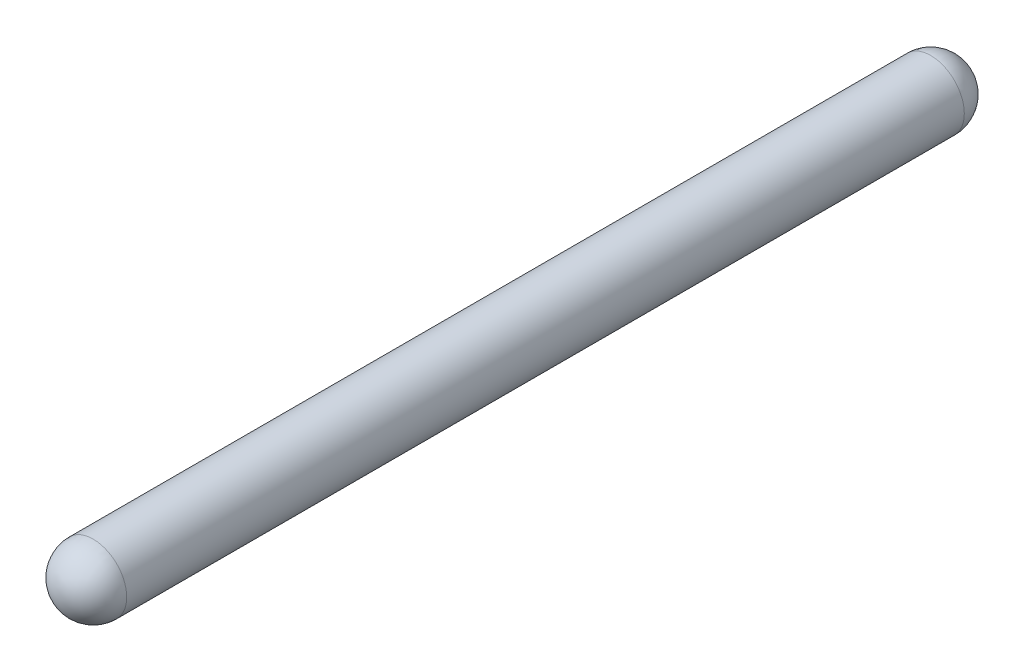
ISO-10303-21;
HEADER;
FILE_DESCRIPTION(('STEP AP214'),'2;1');
FILE_NAME('part.step','',(''),(''),'','','');
FILE_SCHEMA(('AUTOMOTIVE_DESIGN { 1 0 10303 214 1 1 1 1 }'));
ENDSEC;
DATA;
#1=APPLICATION_CONTEXT('core data for automotive mechanical design processes');
#2=APPLICATION_PROTOCOL_DEFINITION('international standard','automotive_design',2000,#1);
#3=PRODUCT_CONTEXT('',#1,'mechanical');
#4=PRODUCT('Part','Part','',(#3));
#5=PRODUCT_RELATED_PRODUCT_CATEGORY('part','',(#4));
#6=PRODUCT_DEFINITION_FORMATION('','',#4);
#7=PRODUCT_DEFINITION_CONTEXT('part definition',#1,'design');
#8=PRODUCT_DEFINITION('design','',#6,#7);
#9=PRODUCT_DEFINITION_SHAPE('','',#8);
#10=(LENGTH_UNIT() NAMED_UNIT(*) SI_UNIT(.MILLI.,.METRE.));
#11=(NAMED_UNIT(*) PLANE_ANGLE_UNIT() SI_UNIT($,.RADIAN.));
#12=(NAMED_UNIT(*) SI_UNIT($,.STERADIAN.) SOLID_ANGLE_UNIT());
#13=UNCERTAINTY_MEASURE_WITH_UNIT(LENGTH_MEASURE(1.E-05),#10,'distance_accuracy_value','');
#14=(GEOMETRIC_REPRESENTATION_CONTEXT(3) GLOBAL_UNCERTAINTY_ASSIGNED_CONTEXT((#13)) GLOBAL_UNIT_ASSIGNED_CONTEXT((#10,
#11,#12)) REPRESENTATION_CONTEXT('',''));
#15=CARTESIAN_POINT('',(0.,0.,0.));
#16=DIRECTION('',(0.,0.,1.));
#17=DIRECTION('',(1.,0.,0.));
#18=AXIS2_PLACEMENT_3D('',#15,#16,#17);
#19=CARTESIAN_POINT('',(0.,0.,-3.));
#20=DIRECTION('',(1.,0.,0.));
#21=DIRECTION('',(0.,-1.,0.));
#22=AXIS2_PLACEMENT_3D('',#19,#20,#21);
#23=SPHERICAL_SURFACE('',#22,0.2);
#24=CARTESIAN_POINT('',(0.,0.,-3.));
#25=DIRECTION('',(0.,0.,1.));
#26=DIRECTION('',(1.,0.,0.));
#27=AXIS2_PLACEMENT_3D('',#24,#25,#26);
#28=CIRCLE('',#27,0.2);
#29=CARTESIAN_POINT('',(0.2,0.,-3.));
#30=VERTEX_POINT('',#29);
#31=CARTESIAN_POINT('',(-0.2,0.,-3.));
#32=VERTEX_POINT('',#31);
#33=EDGE_CURVE('E42',#30,#32,#28,.T.);
#34=ORIENTED_EDGE('',*,*,#33,.F.);
#35=CARTESIAN_POINT('',(0.,0.,-3.));
#36=DIRECTION('',(0.,0.,1.));
#37=DIRECTION('',(1.,0.,0.));
#38=AXIS2_PLACEMENT_3D('',#35,#36,#37);
#39=CIRCLE('',#38,0.2);
#40=EDGE_CURVE('E26',#32,#30,#39,.T.);
#41=ORIENTED_EDGE('',*,*,#40,.F.);
#42=EDGE_LOOP('',(#34,#41));
#43=FACE_BOUND('',#42,.T.);
#44=ADVANCED_FACE('F17',(#43),#23,.T.);
#45=CARTESIAN_POINT('',(0.,0.,2.));
#46=DIRECTION('',(1.,0.,0.));
#47=DIRECTION('',(0.,1.,0.));
#48=AXIS2_PLACEMENT_3D('',#45,#46,#47);
#49=SPHERICAL_SURFACE('',#48,0.2);
#50=CARTESIAN_POINT('',(0.,0.,2.));
#51=DIRECTION('',(0.,0.,1.));
#52=DIRECTION('',(1.,0.,0.));
#53=AXIS2_PLACEMENT_3D('',#50,#51,#52);
#54=CIRCLE('',#53,0.2);
#55=CARTESIAN_POINT('',(0.2,0.,2.));
#56=VERTEX_POINT('',#55);
#57=CARTESIAN_POINT('',(-0.2,0.,2.));
#58=VERTEX_POINT('',#57);
#59=EDGE_CURVE('E11',#56,#58,#54,.F.);
#60=ORIENTED_EDGE('',*,*,#59,.F.);
#61=CARTESIAN_POINT('',(0.,0.,2.));
#62=DIRECTION('',(0.,0.,1.));
#63=DIRECTION('',(1.,0.,0.));
#64=AXIS2_PLACEMENT_3D('',#61,#62,#63);
#65=CIRCLE('',#64,0.2);
#66=EDGE_CURVE('E34',#58,#56,#65,.F.);
#67=ORIENTED_EDGE('',*,*,#66,.F.);
#68=EDGE_LOOP('',(#60,#67));
#69=FACE_BOUND('',#68,.T.);
#70=ADVANCED_FACE('F49',(#69),#49,.T.);
#71=CARTESIAN_POINT('',(0.,0.,-3.));
#72=DIRECTION('',(0.,0.,1.));
#73=DIRECTION('',(1.,0.,0.));
#74=AXIS2_PLACEMENT_3D('',#71,#72,#73);
#75=CYLINDRICAL_SURFACE('',#74,0.2);
#76=ORIENTED_EDGE('',*,*,#66,.T.);
#77=ORIENTED_EDGE('',*,*,#59,.T.);
#78=EDGE_LOOP('',(#76,#77));
#79=FACE_BOUND('',#78,.T.);
#80=ORIENTED_EDGE('',*,*,#40,.T.);
#81=ORIENTED_EDGE('',*,*,#33,.T.);
#82=EDGE_LOOP('',(#80,#81));
#83=FACE_BOUND('',#82,.T.);
#84=ADVANCED_FACE('F45',(#79,#83),#75,.T.);
#85=CLOSED_SHELL('',(#44,#70,#84));
#86=MANIFOLD_SOLID_BREP('B1',#85);
#87=ADVANCED_BREP_SHAPE_REPRESENTATION('',(#18,#86),#14);
#88=SHAPE_DEFINITION_REPRESENTATION(#9,#87);
ENDSEC;
END-ISO-10303-21;
